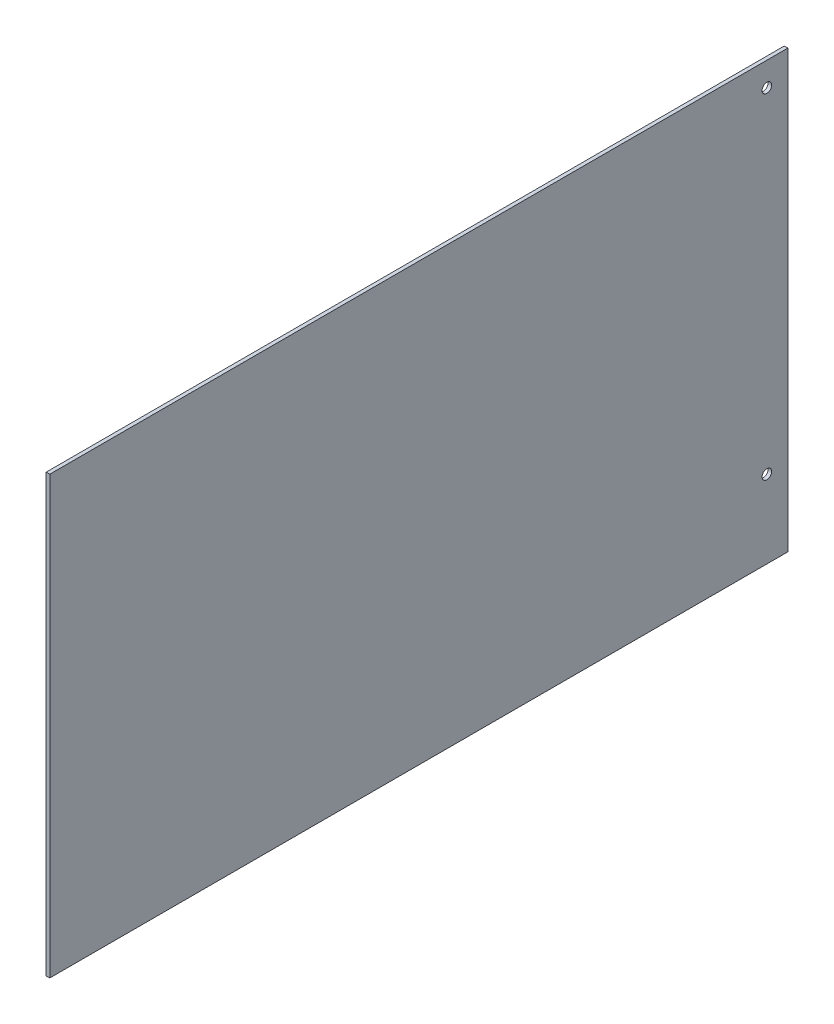
ISO-10303-21;
HEADER;
FILE_DESCRIPTION(('STEP AP214'),'2;1');
FILE_NAME('part.step','',(''),(''),'','','');
FILE_SCHEMA(('AUTOMOTIVE_DESIGN { 1 0 10303 214 1 1 1 1 }'));
ENDSEC;
DATA;
#1=APPLICATION_CONTEXT('core data for automotive mechanical design processes');
#2=APPLICATION_PROTOCOL_DEFINITION('international standard','automotive_design',2000,#1);
#3=PRODUCT_CONTEXT('',#1,'mechanical');
#4=PRODUCT('Part','Part','',(#3));
#5=PRODUCT_RELATED_PRODUCT_CATEGORY('part','',(#4));
#6=PRODUCT_DEFINITION_FORMATION('','',#4);
#7=PRODUCT_DEFINITION_CONTEXT('part definition',#1,'design');
#8=PRODUCT_DEFINITION('design','',#6,#7);
#9=PRODUCT_DEFINITION_SHAPE('','',#8);
#10=(LENGTH_UNIT() NAMED_UNIT(*) SI_UNIT(.MILLI.,.METRE.));
#11=(NAMED_UNIT(*) PLANE_ANGLE_UNIT() SI_UNIT($,.RADIAN.));
#12=(NAMED_UNIT(*) SI_UNIT($,.STERADIAN.) SOLID_ANGLE_UNIT());
#13=UNCERTAINTY_MEASURE_WITH_UNIT(LENGTH_MEASURE(1.E-05),#10,'distance_accuracy_value','');
#14=(GEOMETRIC_REPRESENTATION_CONTEXT(3) GLOBAL_UNCERTAINTY_ASSIGNED_CONTEXT((#13)) GLOBAL_UNIT_ASSIGNED_CONTEXT((#10,
#11,#12)) REPRESENTATION_CONTEXT('',''));
#15=CARTESIAN_POINT('',(0.,0.,0.));
#16=DIRECTION('',(0.,0.,1.));
#17=DIRECTION('',(1.,0.,0.));
#18=AXIS2_PLACEMENT_3D('',#15,#16,#17);
#19=CARTESIAN_POINT('',(3.,156.186873067477,-224.506226375582));
#20=DIRECTION('',(0.,0.,1.));
#21=DIRECTION('',(0.,-1.,0.));
#22=AXIS2_PLACEMENT_3D('',#19,#20,#21);
#23=PLANE('',#22);
#24=DIRECTION('',(0.,1.,0.));
#25=VECTOR('',#24,1.);
#26=CARTESIAN_POINT('',(0.,156.186873067477,-224.506226375582));
#27=LINE('',#26,#25);
#28=CARTESIAN_POINT('',(0.,-208.613126932523,-224.506226375582));
#29=VERTEX_POINT('',#28);
#30=CARTESIAN_POINT('',(0.,156.186873067477,-224.506226375582));
#31=VERTEX_POINT('',#30);
#32=EDGE_CURVE('E95',#29,#31,#27,.T.);
#33=ORIENTED_EDGE('',*,*,#32,.T.);
#34=DIRECTION('',(-1.,0.,0.));
#35=VECTOR('',#34,1.);
#36=CARTESIAN_POINT('',(3.,156.186873067477,-224.506226375582));
#37=LINE('',#36,#35);
#38=CARTESIAN_POINT('',(3.,156.186873067477,-224.506226375582));
#39=VERTEX_POINT('',#38);
#40=EDGE_CURVE('E11',#39,#31,#37,.T.);
#41=ORIENTED_EDGE('',*,*,#40,.F.);
#42=DIRECTION('',(0.,1.,0.));
#43=VECTOR('',#42,1.);
#44=CARTESIAN_POINT('',(3.,156.186873067477,-224.506226375582));
#45=LINE('',#44,#43);
#46=CARTESIAN_POINT('',(3.,-208.613126932523,-224.506226375582));
#47=VERTEX_POINT('',#46);
#48=EDGE_CURVE('E83',#47,#39,#45,.T.);
#49=ORIENTED_EDGE('',*,*,#48,.F.);
#50=DIRECTION('',(-1.,0.,0.));
#51=VECTOR('',#50,1.);
#52=CARTESIAN_POINT('',(3.,-208.613126932523,-224.506226375582));
#53=LINE('',#52,#51);
#54=EDGE_CURVE('E91',#47,#29,#53,.T.);
#55=ORIENTED_EDGE('',*,*,#54,.T.);
#56=EDGE_LOOP('',(#33,#41,#49,#55));
#57=FACE_BOUND('',#56,.T.);
#58=ADVANCED_FACE('F32',(#57),#23,.F.);
#59=CARTESIAN_POINT('',(3.,156.186873067477,392.593773624418));
#60=DIRECTION('',(0.,-1.,0.));
#61=DIRECTION('',(0.,0.,-1.));
#62=AXIS2_PLACEMENT_3D('',#59,#60,#61);
#63=PLANE('',#62);
#64=DIRECTION('',(0.,0.,1.));
#65=VECTOR('',#64,1.);
#66=CARTESIAN_POINT('',(0.,156.186873067477,392.593773624418));
#67=LINE('',#66,#65);
#68=CARTESIAN_POINT('',(0.,156.186873067477,392.593773624418));
#69=VERTEX_POINT('',#68);
#70=EDGE_CURVE('E87',#31,#69,#67,.T.);
#71=ORIENTED_EDGE('',*,*,#70,.T.);
#72=DIRECTION('',(-1.,0.,0.));
#73=VECTOR('',#72,1.);
#74=CARTESIAN_POINT('',(3.,156.186873067477,392.593773624418));
#75=LINE('',#74,#73);
#76=CARTESIAN_POINT('',(3.,156.186873067477,392.593773624418));
#77=VERTEX_POINT('',#76);
#78=EDGE_CURVE('E40',#77,#69,#75,.T.);
#79=ORIENTED_EDGE('',*,*,#78,.F.);
#80=DIRECTION('',(0.,0.,1.));
#81=VECTOR('',#80,1.);
#82=CARTESIAN_POINT('',(3.,156.186873067477,392.593773624418));
#83=LINE('',#82,#81);
#84=EDGE_CURVE('E78',#39,#77,#83,.T.);
#85=ORIENTED_EDGE('',*,*,#84,.F.);
#86=ORIENTED_EDGE('',*,*,#40,.T.);
#87=EDGE_LOOP('',(#71,#79,#85,#86));
#88=FACE_BOUND('',#87,.T.);
#89=ADVANCED_FACE('F86',(#88),#63,.F.);
#90=CARTESIAN_POINT('',(3.,156.186873067477,392.593773624418));
#91=DIRECTION('',(0.,0.,-1.));
#92=DIRECTION('',(0.,1.,0.));
#93=AXIS2_PLACEMENT_3D('',#90,#91,#92);
#94=PLANE('',#93);
#95=DIRECTION('',(0.,-1.,0.));
#96=VECTOR('',#95,1.);
#97=CARTESIAN_POINT('',(0.,156.186873067477,392.593773624418));
#98=LINE('',#97,#96);
#99=CARTESIAN_POINT('',(0.,-208.613126932523,392.593773624418));
#100=VERTEX_POINT('',#99);
#101=EDGE_CURVE('E65',#69,#100,#98,.T.);
#102=ORIENTED_EDGE('',*,*,#101,.T.);
#103=DIRECTION('',(-1.,0.,0.));
#104=VECTOR('',#103,1.);
#105=CARTESIAN_POINT('',(3.,-208.613126932523,392.593773624418));
#106=LINE('',#105,#104);
#107=CARTESIAN_POINT('',(3.,-208.613126932523,392.593773624418));
#108=VERTEX_POINT('',#107);
#109=EDGE_CURVE('E88',#108,#100,#106,.T.);
#110=ORIENTED_EDGE('',*,*,#109,.F.);
#111=DIRECTION('',(0.,-1.,0.));
#112=VECTOR('',#111,1.);
#113=CARTESIAN_POINT('',(3.,156.186873067477,392.593773624418));
#114=LINE('',#113,#112);
#115=EDGE_CURVE('E81',#77,#108,#114,.T.);
#116=ORIENTED_EDGE('',*,*,#115,.F.);
#117=ORIENTED_EDGE('',*,*,#78,.T.);
#118=EDGE_LOOP('',(#102,#110,#116,#117));
#119=FACE_BOUND('',#118,.T.);
#120=ADVANCED_FACE('F89',(#119),#94,.F.);
#121=CARTESIAN_POINT('',(3.,-208.613126932523,392.593773624418));
#122=DIRECTION('',(0.,1.,0.));
#123=DIRECTION('',(0.,0.,1.));
#124=AXIS2_PLACEMENT_3D('',#121,#122,#123);
#125=PLANE('',#124);
#126=DIRECTION('',(0.,0.,-1.));
#127=VECTOR('',#126,1.);
#128=CARTESIAN_POINT('',(0.,-208.613126932523,392.593773624418));
#129=LINE('',#128,#127);
#130=EDGE_CURVE('E71',#100,#29,#129,.T.);
#131=ORIENTED_EDGE('',*,*,#130,.T.);
#132=ORIENTED_EDGE('',*,*,#54,.F.);
#133=DIRECTION('',(0.,0.,-1.));
#134=VECTOR('',#133,1.);
#135=CARTESIAN_POINT('',(3.,-208.613126932523,392.593773624418));
#136=LINE('',#135,#134);
#137=EDGE_CURVE('E48',#108,#47,#136,.T.);
#138=ORIENTED_EDGE('',*,*,#137,.F.);
#139=ORIENTED_EDGE('',*,*,#109,.T.);
#140=EDGE_LOOP('',(#131,#132,#138,#139));
#141=FACE_BOUND('',#140,.T.);
#142=ADVANCED_FACE('F103',(#141),#125,.F.);
#143=CARTESIAN_POINT('',(3.,0.,0.));
#144=DIRECTION('',(1.,0.,0.));
#145=DIRECTION('',(0.,0.,-1.));
#146=AXIS2_PLACEMENT_3D('',#143,#144,#145);
#147=PLANE('',#146);
#148=CARTESIAN_POINT('',(3.,136.186873067477,-207.006226375582));
#149=DIRECTION('',(-1.,0.,0.));
#150=DIRECTION('',(0.,0.,1.));
#151=AXIS2_PLACEMENT_3D('',#148,#149,#150);
#152=CIRCLE('',#151,3.99999999999999);
#153=CARTESIAN_POINT('',(3.,136.186873067477,-203.006226375582));
#154=VERTEX_POINT('',#153);
#155=EDGE_CURVE('E112',#154,#154,#152,.T.);
#156=ORIENTED_EDGE('',*,*,#155,.T.);
#157=EDGE_LOOP('',(#156));
#158=FACE_BOUND('',#157,.T.);
#159=CARTESIAN_POINT('',(3.,-143.613126932523,-207.006226375582));
#160=DIRECTION('',(-1.,0.,0.));
#161=DIRECTION('',(0.,0.,1.));
#162=AXIS2_PLACEMENT_3D('',#159,#160,#161);
#163=CIRCLE('',#162,3.99999999999999);
#164=CARTESIAN_POINT('',(3.,-143.613126932523,-203.006226375582));
#165=VERTEX_POINT('',#164);
#166=EDGE_CURVE('E98',#165,#165,#163,.T.);
#167=ORIENTED_EDGE('',*,*,#166,.T.);
#168=EDGE_LOOP('',(#167));
#169=FACE_BOUND('',#168,.T.);
#170=ORIENTED_EDGE('',*,*,#48,.T.);
#171=ORIENTED_EDGE('',*,*,#84,.T.);
#172=ORIENTED_EDGE('',*,*,#115,.T.);
#173=ORIENTED_EDGE('',*,*,#137,.T.);
#174=EDGE_LOOP('',(#170,#171,#172,#173));
#175=FACE_BOUND('',#174,.T.);
#176=ADVANCED_FACE('F79',(#158,#169,#175),#147,.T.);
#177=CARTESIAN_POINT('',(0.,0.,0.));
#178=DIRECTION('',(1.,0.,0.));
#179=DIRECTION('',(0.,0.,-1.));
#180=AXIS2_PLACEMENT_3D('',#177,#178,#179);
#181=PLANE('',#180);
#182=CARTESIAN_POINT('',(0.,136.186873067477,-207.006226375582));
#183=DIRECTION('',(-1.,0.,0.));
#184=DIRECTION('',(0.,0.,1.));
#185=AXIS2_PLACEMENT_3D('',#182,#183,#184);
#186=CIRCLE('',#185,3.99999999999999);
#187=CARTESIAN_POINT('',(0.,136.186873067477,-203.006226375582));
#188=VERTEX_POINT('',#187);
#189=EDGE_CURVE('E115',#188,#188,#186,.T.);
#190=ORIENTED_EDGE('',*,*,#189,.F.);
#191=EDGE_LOOP('',(#190));
#192=FACE_BOUND('',#191,.T.);
#193=CARTESIAN_POINT('',(0.,-143.613126932523,-207.006226375582));
#194=DIRECTION('',(-1.,0.,0.));
#195=DIRECTION('',(0.,0.,1.));
#196=AXIS2_PLACEMENT_3D('',#193,#194,#195);
#197=CIRCLE('',#196,3.99999999999999);
#198=CARTESIAN_POINT('',(0.,-143.613126932523,-203.006226375582));
#199=VERTEX_POINT('',#198);
#200=EDGE_CURVE('E109',#199,#199,#197,.T.);
#201=ORIENTED_EDGE('',*,*,#200,.F.);
#202=EDGE_LOOP('',(#201));
#203=FACE_BOUND('',#202,.T.);
#204=ORIENTED_EDGE('',*,*,#32,.F.);
#205=ORIENTED_EDGE('',*,*,#130,.F.);
#206=ORIENTED_EDGE('',*,*,#101,.F.);
#207=ORIENTED_EDGE('',*,*,#70,.F.);
#208=EDGE_LOOP('',(#204,#205,#206,#207));
#209=FACE_BOUND('',#208,.T.);
#210=ADVANCED_FACE('F106',(#192,#203,#209),#181,.F.);
#211=CARTESIAN_POINT('',(3.,-143.613126932523,-207.006226375582));
#212=DIRECTION('',(-1.,0.,0.));
#213=DIRECTION('',(0.,0.,1.));
#214=AXIS2_PLACEMENT_3D('',#211,#212,#213);
#215=CYLINDRICAL_SURFACE('',#214,3.99999999999999);
#216=ORIENTED_EDGE('',*,*,#166,.F.);
#217=EDGE_LOOP('',(#216));
#218=FACE_BOUND('',#217,.T.);
#219=ORIENTED_EDGE('',*,*,#200,.T.);
#220=EDGE_LOOP('',(#219));
#221=FACE_BOUND('',#220,.T.);
#222=ADVANCED_FACE('F126',(#218,#221),#215,.F.);
#223=CARTESIAN_POINT('',(3.,136.186873067477,-207.006226375582));
#224=DIRECTION('',(-1.,0.,0.));
#225=DIRECTION('',(0.,0.,1.));
#226=AXIS2_PLACEMENT_3D('',#223,#224,#225);
#227=CYLINDRICAL_SURFACE('',#226,3.99999999999999);
#228=ORIENTED_EDGE('',*,*,#155,.F.);
#229=EDGE_LOOP('',(#228));
#230=FACE_BOUND('',#229,.T.);
#231=ORIENTED_EDGE('',*,*,#189,.T.);
#232=EDGE_LOOP('',(#231));
#233=FACE_BOUND('',#232,.T.);
#234=ADVANCED_FACE('F123',(#230,#233),#227,.F.);
#235=CLOSED_SHELL('',(#58,#89,#120,#142,#176,#210,#222,#234));
#236=MANIFOLD_SOLID_BREP('B2',#235);
#237=ADVANCED_BREP_SHAPE_REPRESENTATION('',(#18,#236),#14);
#238=SHAPE_DEFINITION_REPRESENTATION(#9,#237);
ENDSEC;
END-ISO-10303-21;
